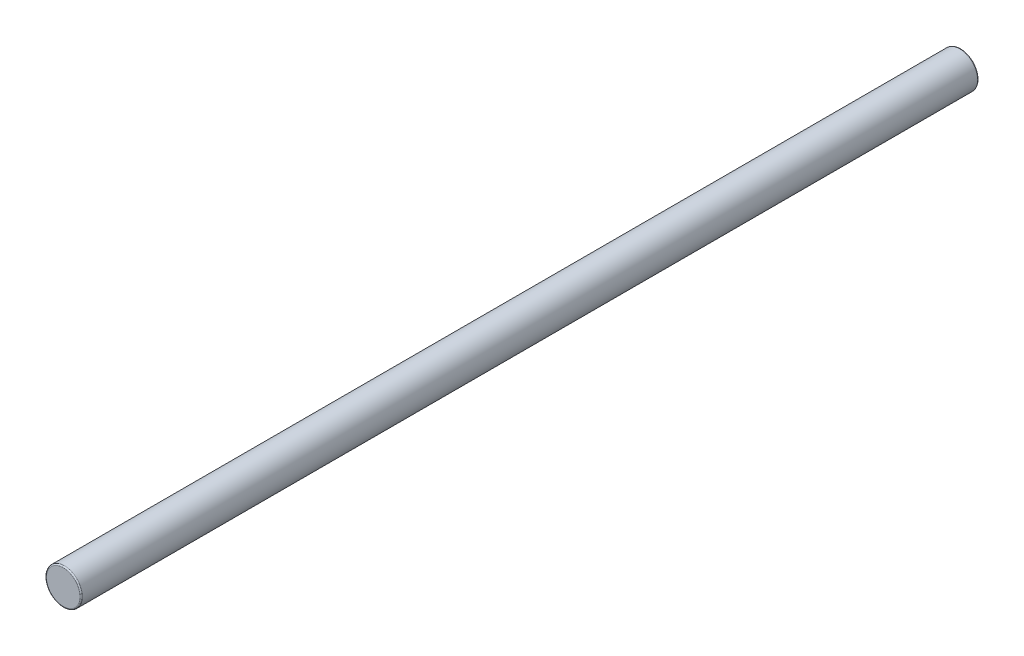
ISO-10303-21;
HEADER;
FILE_DESCRIPTION(('STEP AP214'),'2;1');
FILE_NAME('part.step','',(''),(''),'','','');
FILE_SCHEMA(('AUTOMOTIVE_DESIGN { 1 0 10303 214 1 1 1 1 }'));
ENDSEC;
DATA;
#1=APPLICATION_CONTEXT('core data for automotive mechanical design processes');
#2=APPLICATION_PROTOCOL_DEFINITION('international standard','automotive_design',2000,#1);
#3=PRODUCT_CONTEXT('',#1,'mechanical');
#4=PRODUCT('Part','Part','',(#3));
#5=PRODUCT_RELATED_PRODUCT_CATEGORY('part','',(#4));
#6=PRODUCT_DEFINITION_FORMATION('','',#4);
#7=PRODUCT_DEFINITION_CONTEXT('part definition',#1,'design');
#8=PRODUCT_DEFINITION('design','',#6,#7);
#9=PRODUCT_DEFINITION_SHAPE('','',#8);
#10=(LENGTH_UNIT() NAMED_UNIT(*) SI_UNIT(.MILLI.,.METRE.));
#11=(NAMED_UNIT(*) PLANE_ANGLE_UNIT() SI_UNIT($,.RADIAN.));
#12=(NAMED_UNIT(*) SI_UNIT($,.STERADIAN.) SOLID_ANGLE_UNIT());
#13=UNCERTAINTY_MEASURE_WITH_UNIT(LENGTH_MEASURE(1.E-05),#10,'distance_accuracy_value','');
#14=(GEOMETRIC_REPRESENTATION_CONTEXT(3) GLOBAL_UNCERTAINTY_ASSIGNED_CONTEXT((#13)) GLOBAL_UNIT_ASSIGNED_CONTEXT((#10,
#11,#12)) REPRESENTATION_CONTEXT('',''));
#15=CARTESIAN_POINT('',(0.,0.,0.));
#16=DIRECTION('',(0.,0.,1.));
#17=DIRECTION('',(1.,0.,0.));
#18=AXIS2_PLACEMENT_3D('',#15,#16,#17);
#19=CARTESIAN_POINT('',(0.,0.,-150.));
#20=DIRECTION('',(0.,0.,1.));
#21=DIRECTION('',(1.,0.,0.));
#22=AXIS2_PLACEMENT_3D('',#19,#20,#21);
#23=CYLINDRICAL_SURFACE('',#22,3.);
#24=CARTESIAN_POINT('',(0.,0.,-149.8));
#25=DIRECTION('',(0.,0.,1.));
#26=DIRECTION('',(1.,0.,0.));
#27=AXIS2_PLACEMENT_3D('',#24,#25,#26);
#28=CIRCLE('',#27,3.);
#29=CARTESIAN_POINT('',(3.,0.,-149.8));
#30=VERTEX_POINT('',#29);
#31=EDGE_CURVE('E41',#30,#30,#28,.T.);
#32=ORIENTED_EDGE('',*,*,#31,.T.);
#33=EDGE_LOOP('',(#32));
#34=FACE_BOUND('',#33,.T.);
#35=CARTESIAN_POINT('',(0.,0.,-0.200000000000006));
#36=DIRECTION('',(0.,0.,1.));
#37=DIRECTION('',(1.,0.,0.));
#38=AXIS2_PLACEMENT_3D('',#35,#36,#37);
#39=CIRCLE('',#38,3.);
#40=CARTESIAN_POINT('',(3.,0.,-0.200000000000006));
#41=VERTEX_POINT('',#40);
#42=EDGE_CURVE('E45',#41,#41,#39,.F.);
#43=ORIENTED_EDGE('',*,*,#42,.T.);
#44=EDGE_LOOP('',(#43));
#45=FACE_BOUND('',#44,.T.);
#46=ADVANCED_FACE('F30',(#34,#45),#23,.T.);
#47=CARTESIAN_POINT('',(0.,0.,-150.));
#48=DIRECTION('',(0.,0.,1.));
#49=DIRECTION('',(1.,0.,0.));
#50=AXIS2_PLACEMENT_3D('',#47,#48,#49);
#51=PLANE('',#50);
#52=CARTESIAN_POINT('',(0.,0.,-150.));
#53=DIRECTION('',(0.,0.,1.));
#54=DIRECTION('',(1.,0.,0.));
#55=AXIS2_PLACEMENT_3D('',#52,#53,#54);
#56=CIRCLE('',#55,2.8);
#57=CARTESIAN_POINT('',(2.8,0.,-150.));
#58=VERTEX_POINT('',#57);
#59=EDGE_CURVE('E37',#58,#58,#56,.F.);
#60=ORIENTED_EDGE('',*,*,#59,.T.);
#61=EDGE_LOOP('',(#60));
#62=FACE_BOUND('',#61,.T.);
#63=ADVANCED_FACE('F61',(#62),#51,.F.);
#64=CARTESIAN_POINT('',(0.,0.,0.));
#65=DIRECTION('',(0.,0.,1.));
#66=DIRECTION('',(1.,0.,0.));
#67=AXIS2_PLACEMENT_3D('',#64,#65,#66);
#68=PLANE('',#67);
#69=CARTESIAN_POINT('',(0.,0.,0.));
#70=DIRECTION('',(0.,0.,1.));
#71=DIRECTION('',(1.,0.,0.));
#72=AXIS2_PLACEMENT_3D('',#69,#70,#71);
#73=CIRCLE('',#72,2.8);
#74=CARTESIAN_POINT('',(2.8,0.,0.));
#75=VERTEX_POINT('',#74);
#76=EDGE_CURVE('E10',#75,#75,#73,.T.);
#77=ORIENTED_EDGE('',*,*,#76,.T.);
#78=EDGE_LOOP('',(#77));
#79=FACE_BOUND('',#78,.T.);
#80=ADVANCED_FACE('F58',(#79),#68,.T.);
#81=CARTESIAN_POINT('',(0.,0.,-149.8));
#82=DIRECTION('',(0.,0.,1.));
#83=DIRECTION('',(1.,0.,0.));
#84=AXIS2_PLACEMENT_3D('',#81,#82,#83);
#85=TOROIDAL_SURFACE('',#84,2.8,0.2);
#86=ORIENTED_EDGE('',*,*,#59,.F.);
#87=EDGE_LOOP('',(#86));
#88=FACE_BOUND('',#87,.T.);
#89=ORIENTED_EDGE('',*,*,#31,.F.);
#90=EDGE_LOOP('',(#89));
#91=FACE_BOUND('',#90,.T.);
#92=ADVANCED_FACE('F54',(#88,#91),#85,.T.);
#93=CARTESIAN_POINT('',(0.,0.,-0.200000000000006));
#94=DIRECTION('',(0.,0.,1.));
#95=DIRECTION('',(1.,0.,0.));
#96=AXIS2_PLACEMENT_3D('',#93,#94,#95);
#97=TOROIDAL_SURFACE('',#96,2.8,0.2);
#98=ORIENTED_EDGE('',*,*,#42,.F.);
#99=EDGE_LOOP('',(#98));
#100=FACE_BOUND('',#99,.T.);
#101=ORIENTED_EDGE('',*,*,#76,.F.);
#102=EDGE_LOOP('',(#101));
#103=FACE_BOUND('',#102,.T.);
#104=ADVANCED_FACE('F32',(#100,#103),#97,.T.);
#105=CLOSED_SHELL('',(#46,#63,#80,#92,#104));
#106=MANIFOLD_SOLID_BREP('B2',#105);
#107=ADVANCED_BREP_SHAPE_REPRESENTATION('',(#18,#106),#14);
#108=SHAPE_DEFINITION_REPRESENTATION(#9,#107);
ENDSEC;
END-ISO-10303-21;
